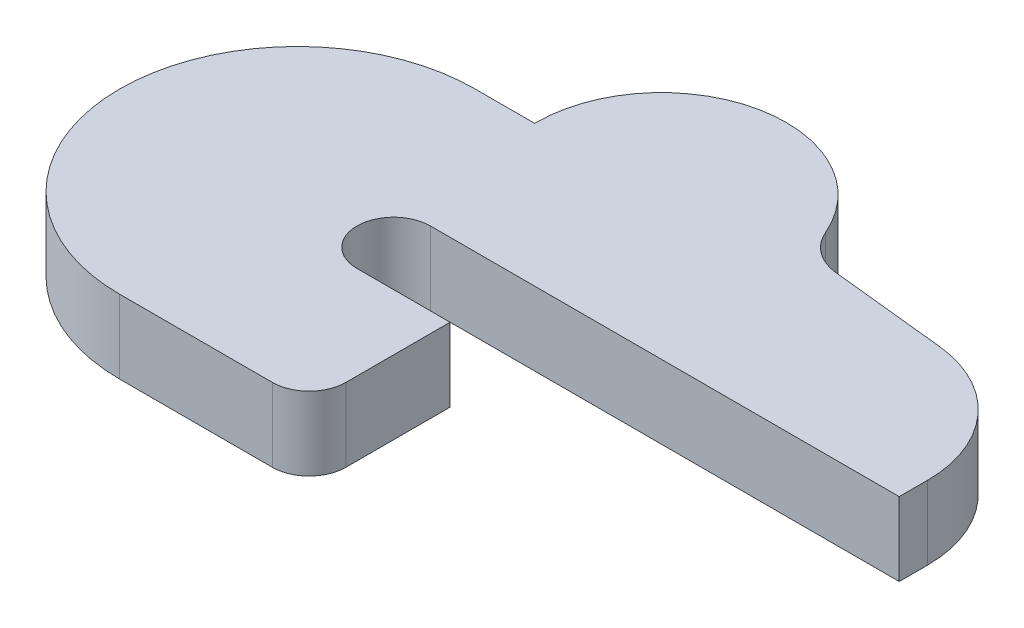
ISO-10303-21;
HEADER;
FILE_DESCRIPTION(('STEP AP214'),'2;1');
FILE_NAME('part.step','',(''),(''),'','','');
FILE_SCHEMA(('AUTOMOTIVE_DESIGN { 1 0 10303 214 1 1 1 1 }'));
ENDSEC;
DATA;
#1=APPLICATION_CONTEXT('core data for automotive mechanical design processes');
#2=APPLICATION_PROTOCOL_DEFINITION('international standard','automotive_design',2000,#1);
#3=PRODUCT_CONTEXT('',#1,'mechanical');
#4=PRODUCT('Part','Part','',(#3));
#5=PRODUCT_RELATED_PRODUCT_CATEGORY('part','',(#4));
#6=PRODUCT_DEFINITION_FORMATION('','',#4);
#7=PRODUCT_DEFINITION_CONTEXT('part definition',#1,'design');
#8=PRODUCT_DEFINITION('design','',#6,#7);
#9=PRODUCT_DEFINITION_SHAPE('','',#8);
#10=(LENGTH_UNIT() NAMED_UNIT(*) SI_UNIT(.MILLI.,.METRE.));
#11=(NAMED_UNIT(*) PLANE_ANGLE_UNIT() SI_UNIT($,.RADIAN.));
#12=(NAMED_UNIT(*) SI_UNIT($,.STERADIAN.) SOLID_ANGLE_UNIT());
#13=UNCERTAINTY_MEASURE_WITH_UNIT(LENGTH_MEASURE(1.E-05),#10,'distance_accuracy_value','');
#14=(GEOMETRIC_REPRESENTATION_CONTEXT(3) GLOBAL_UNCERTAINTY_ASSIGNED_CONTEXT((#13)) GLOBAL_UNIT_ASSIGNED_CONTEXT((#10,
#11,#12)) REPRESENTATION_CONTEXT('',''));
#15=CARTESIAN_POINT('',(0.,0.,0.));
#16=DIRECTION('',(0.,0.,1.));
#17=DIRECTION('',(1.,0.,0.));
#18=AXIS2_PLACEMENT_3D('',#15,#16,#17);
#19=CARTESIAN_POINT('',(0.,3.,4.25));
#20=DIRECTION('',(-1.,0.,0.));
#21=DIRECTION('',(0.,0.,1.));
#22=AXIS2_PLACEMENT_3D('',#19,#20,#21);
#23=PLANE('',#22);
#24=DIRECTION('',(0.,0.,-1.));
#25=VECTOR('',#24,1.);
#26=CARTESIAN_POINT('',(0.,0.,4.25));
#27=LINE('',#26,#25);
#28=CARTESIAN_POINT('',(0.,0.,4.25));
#29=VERTEX_POINT('',#28);
#30=CARTESIAN_POINT('',(0.,0.,0.));
#31=VERTEX_POINT('',#30);
#32=EDGE_CURVE('E165',#29,#31,#27,.T.);
#33=ORIENTED_EDGE('',*,*,#32,.T.);
#34=DIRECTION('',(0.,-1.,0.));
#35=VECTOR('',#34,1.);
#36=CARTESIAN_POINT('',(0.,3.,0.));
#37=LINE('',#36,#35);
#38=CARTESIAN_POINT('',(0.,3.,0.));
#39=VERTEX_POINT('',#38);
#40=EDGE_CURVE('E11',#39,#31,#37,.T.);
#41=ORIENTED_EDGE('',*,*,#40,.F.);
#42=DIRECTION('',(0.,0.,-1.));
#43=VECTOR('',#42,1.);
#44=CARTESIAN_POINT('',(0.,3.,4.25));
#45=LINE('',#44,#43);
#46=CARTESIAN_POINT('',(0.,3.,4.25));
#47=VERTEX_POINT('',#46);
#48=EDGE_CURVE('E191',#47,#39,#45,.T.);
#49=ORIENTED_EDGE('',*,*,#48,.F.);
#50=DIRECTION('',(0.,-1.,0.));
#51=VECTOR('',#50,1.);
#52=CARTESIAN_POINT('',(0.,3.,4.25));
#53=LINE('',#52,#51);
#54=EDGE_CURVE('E161',#47,#29,#53,.T.);
#55=ORIENTED_EDGE('',*,*,#54,.T.);
#56=EDGE_LOOP('',(#33,#41,#49,#55));
#57=FACE_BOUND('',#56,.T.);
#58=ADVANCED_FACE('F33',(#57),#23,.F.);
#59=CARTESIAN_POINT('',(0.,3.,0.));
#60=DIRECTION('',(0.,0.,1.));
#61=DIRECTION('',(1.,0.,0.));
#62=AXIS2_PLACEMENT_3D('',#59,#60,#61);
#63=PLANE('',#62);
#64=DIRECTION('',(-1.,0.,0.));
#65=VECTOR('',#64,1.);
#66=CARTESIAN_POINT('',(0.,0.,0.));
#67=LINE('',#66,#65);
#68=CARTESIAN_POINT('',(-3.8,0.,0.));
#69=VERTEX_POINT('',#68);
#70=EDGE_CURVE('E168',#31,#69,#67,.T.);
#71=ORIENTED_EDGE('',*,*,#70,.T.);
#72=DIRECTION('',(0.,-1.,0.));
#73=VECTOR('',#72,1.);
#74=CARTESIAN_POINT('',(-3.8,3.,0.));
#75=LINE('',#74,#73);
#76=CARTESIAN_POINT('',(-3.8,3.,0.));
#77=VERTEX_POINT('',#76);
#78=EDGE_CURVE('E41',#77,#69,#75,.T.);
#79=ORIENTED_EDGE('',*,*,#78,.F.);
#80=DIRECTION('',(-1.,0.,0.));
#81=VECTOR('',#80,1.);
#82=CARTESIAN_POINT('',(0.,3.,0.));
#83=LINE('',#82,#81);
#84=EDGE_CURVE('E110',#39,#77,#83,.T.);
#85=ORIENTED_EDGE('',*,*,#84,.F.);
#86=ORIENTED_EDGE('',*,*,#40,.T.);
#87=EDGE_LOOP('',(#71,#79,#85,#86));
#88=FACE_BOUND('',#87,.T.);
#89=ADVANCED_FACE('F279',(#88),#63,.F.);
#90=CARTESIAN_POINT('',(-3.8,3.,-1.5));
#91=DIRECTION('',(0.,-1.,0.));
#92=DIRECTION('',(0.,0.,-1.));
#93=AXIS2_PLACEMENT_3D('',#90,#91,#92);
#94=CYLINDRICAL_SURFACE('',#93,1.5);
#95=CARTESIAN_POINT('',(-3.8,0.,-1.5));
#96=DIRECTION('',(0.,-1.,0.));
#97=DIRECTION('',(0.,0.,-1.));
#98=AXIS2_PLACEMENT_3D('',#95,#96,#97);
#99=CIRCLE('',#98,1.5);
#100=CARTESIAN_POINT('',(-3.8,0.,-3.));
#101=VERTEX_POINT('',#100);
#102=EDGE_CURVE('E170',#69,#101,#99,.T.);
#103=ORIENTED_EDGE('',*,*,#102,.T.);
#104=DIRECTION('',(0.,-1.,0.));
#105=VECTOR('',#104,1.);
#106=CARTESIAN_POINT('',(-3.8,3.,-3.));
#107=LINE('',#106,#105);
#108=CARTESIAN_POINT('',(-3.8,3.,-3.));
#109=VERTEX_POINT('',#108);
#110=EDGE_CURVE('E216',#109,#101,#107,.T.);
#111=ORIENTED_EDGE('',*,*,#110,.F.);
#112=CARTESIAN_POINT('',(-3.8,3.,-1.5));
#113=DIRECTION('',(0.,-1.,0.));
#114=DIRECTION('',(0.,0.,-1.));
#115=AXIS2_PLACEMENT_3D('',#112,#113,#114);
#116=CIRCLE('',#115,1.5);
#117=EDGE_CURVE('E224',#77,#109,#116,.T.);
#118=ORIENTED_EDGE('',*,*,#117,.F.);
#119=ORIENTED_EDGE('',*,*,#78,.T.);
#120=EDGE_LOOP('',(#103,#111,#118,#119));
#121=FACE_BOUND('',#120,.T.);
#122=ADVANCED_FACE('F222',(#121),#94,.F.);
#123=CARTESIAN_POINT('',(-3.8,3.,-3.));
#124=DIRECTION('',(0.,0.,-1.));
#125=DIRECTION('',(-1.,0.,0.));
#126=AXIS2_PLACEMENT_3D('',#123,#124,#125);
#127=PLANE('',#126);
#128=DIRECTION('',(1.,0.,0.));
#129=VECTOR('',#128,1.);
#130=CARTESIAN_POINT('',(-3.8,0.,-3.));
#131=LINE('',#130,#129);
#132=CARTESIAN_POINT('',(15.32,0.,-3.));
#133=VERTEX_POINT('',#132);
#134=EDGE_CURVE('E172',#101,#133,#131,.T.);
#135=ORIENTED_EDGE('',*,*,#134,.T.);
#136=DIRECTION('',(0.,-1.,0.));
#137=VECTOR('',#136,1.);
#138=CARTESIAN_POINT('',(15.32,3.,-3.));
#139=LINE('',#138,#137);
#140=CARTESIAN_POINT('',(15.32,3.,-3.));
#141=VERTEX_POINT('',#140);
#142=EDGE_CURVE('E213',#141,#133,#139,.T.);
#143=ORIENTED_EDGE('',*,*,#142,.F.);
#144=DIRECTION('',(1.,0.,0.));
#145=VECTOR('',#144,1.);
#146=CARTESIAN_POINT('',(-3.8,3.,-3.));
#147=LINE('',#146,#145);
#148=EDGE_CURVE('E242',#109,#141,#147,.T.);
#149=ORIENTED_EDGE('',*,*,#148,.F.);
#150=ORIENTED_EDGE('',*,*,#110,.T.);
#151=EDGE_LOOP('',(#135,#143,#149,#150));
#152=FACE_BOUND('',#151,.T.);
#153=ADVANCED_FACE('F233',(#152),#127,.F.);
#154=CARTESIAN_POINT('',(15.32,3.,-3.));
#155=DIRECTION('',(-1.,0.,0.));
#156=DIRECTION('',(0.,0.,1.));
#157=AXIS2_PLACEMENT_3D('',#154,#155,#156);
#158=PLANE('',#157);
#159=DIRECTION('',(0.,0.,-1.));
#160=VECTOR('',#159,1.);
#161=CARTESIAN_POINT('',(15.32,0.,-3.));
#162=LINE('',#161,#160);
#163=CARTESIAN_POINT('',(15.32,0.,-4.15136520655236));
#164=VERTEX_POINT('',#163);
#165=EDGE_CURVE('E174',#133,#164,#162,.T.);
#166=ORIENTED_EDGE('',*,*,#165,.T.);
#167=DIRECTION('',(0.,-1.,0.));
#168=VECTOR('',#167,1.);
#169=CARTESIAN_POINT('',(15.32,3.,-4.15136520655236));
#170=LINE('',#169,#168);
#171=CARTESIAN_POINT('',(15.32,3.,-4.15136520655236));
#172=VERTEX_POINT('',#171);
#173=EDGE_CURVE('E210',#172,#164,#170,.T.);
#174=ORIENTED_EDGE('',*,*,#173,.F.);
#175=DIRECTION('',(0.,0.,-1.));
#176=VECTOR('',#175,1.);
#177=CARTESIAN_POINT('',(15.32,3.,-3.));
#178=LINE('',#177,#176);
#179=EDGE_CURVE('E239',#141,#172,#178,.T.);
#180=ORIENTED_EDGE('',*,*,#179,.F.);
#181=ORIENTED_EDGE('',*,*,#142,.T.);
#182=EDGE_LOOP('',(#166,#174,#180,#181));
#183=FACE_BOUND('',#182,.T.);
#184=ADVANCED_FACE('F237',(#183),#158,.F.);
#185=CARTESIAN_POINT('',(10.32,3.,-4.15136520655234));
#186=DIRECTION('',(0.,-1.,0.));
#187=DIRECTION('',(0.,0.,-1.));
#188=AXIS2_PLACEMENT_3D('',#185,#186,#187);
#189=CYLINDRICAL_SURFACE('',#188,5.);
#190=CARTESIAN_POINT('',(10.32,0.,-4.15136520655234));
#191=DIRECTION('',(0.,1.,0.));
#192=DIRECTION('',(0.,0.,1.));
#193=AXIS2_PLACEMENT_3D('',#190,#191,#192);
#194=CIRCLE('',#193,5.);
#195=CARTESIAN_POINT('',(10.8426423163383,0.,-9.1239746833937));
#196=VERTEX_POINT('',#195);
#197=EDGE_CURVE('E176',#164,#196,#194,.T.);
#198=ORIENTED_EDGE('',*,*,#197,.T.);
#199=DIRECTION('',(0.,-1.,0.));
#200=VECTOR('',#199,1.);
#201=CARTESIAN_POINT('',(10.8426423163383,3.,-9.1239746833937));
#202=LINE('',#201,#200);
#203=CARTESIAN_POINT('',(10.8426423163383,3.,-9.1239746833937));
#204=VERTEX_POINT('',#203);
#205=EDGE_CURVE('E207',#204,#196,#202,.T.);
#206=ORIENTED_EDGE('',*,*,#205,.F.);
#207=CARTESIAN_POINT('',(10.32,3.,-4.15136520655234));
#208=DIRECTION('',(0.,1.,0.));
#209=DIRECTION('',(0.,0.,1.));
#210=AXIS2_PLACEMENT_3D('',#207,#208,#209);
#211=CIRCLE('',#210,5.);
#212=EDGE_CURVE('E241',#172,#204,#211,.T.);
#213=ORIENTED_EDGE('',*,*,#212,.F.);
#214=ORIENTED_EDGE('',*,*,#173,.T.);
#215=EDGE_LOOP('',(#198,#206,#213,#214));
#216=FACE_BOUND('',#215,.T.);
#217=ADVANCED_FACE('F292',(#216),#189,.T.);
#218=CARTESIAN_POINT('',(6.11739670331232,3.,-9.62061800999329));
#219=DIRECTION('',(-0.104528463267653,0.,0.994521895368273));
#220=DIRECTION('',(0.994521895368273,0.,0.104528463267653));
#221=AXIS2_PLACEMENT_3D('',#218,#219,#220);
#222=PLANE('',#221);
#223=DIRECTION('',(-0.994521895368273,0.,-0.104528463267653));
#224=VECTOR('',#223,1.);
#225=CARTESIAN_POINT('',(6.11739670331232,0.,-9.62061800999329));
#226=LINE('',#225,#224);
#227=CARTESIAN_POINT('',(6.11739670331232,0.,-9.62061800999329));
#228=VERTEX_POINT('',#227);
#229=EDGE_CURVE('E178',#196,#228,#226,.T.);
#230=ORIENTED_EDGE('',*,*,#229,.T.);
#231=DIRECTION('',(0.,-1.,0.));
#232=VECTOR('',#231,1.);
#233=CARTESIAN_POINT('',(6.11739670331232,3.,-9.62061800999329));
#234=LINE('',#233,#232);
#235=CARTESIAN_POINT('',(6.11739670331232,3.,-9.62061800999329));
#236=VERTEX_POINT('',#235);
#237=EDGE_CURVE('E204',#236,#228,#234,.T.);
#238=ORIENTED_EDGE('',*,*,#237,.F.);
#239=DIRECTION('',(-0.994521895368273,0.,-0.104528463267653));
#240=VECTOR('',#239,1.);
#241=CARTESIAN_POINT('',(6.11739670331232,3.,-9.62061800999329));
#242=LINE('',#241,#240);
#243=EDGE_CURVE('E244',#204,#236,#242,.T.);
#244=ORIENTED_EDGE('',*,*,#243,.F.);
#245=ORIENTED_EDGE('',*,*,#205,.T.);
#246=EDGE_LOOP('',(#230,#238,#244,#245));
#247=FACE_BOUND('',#246,.T.);
#248=ADVANCED_FACE('F295',(#247),#222,.F.);
#249=CARTESIAN_POINT('',(6.32645362984763,3.,-11.6096618007298));
#250=DIRECTION('',(0.,-1.,0.));
#251=DIRECTION('',(0.,0.,-1.));
#252=AXIS2_PLACEMENT_3D('',#249,#250,#251);
#253=CYLINDRICAL_SURFACE('',#252,2.);
#254=CARTESIAN_POINT('',(6.32645362984763,0.,-11.6096618007298));
#255=DIRECTION('',(0.,-1.,0.));
#256=DIRECTION('',(0.,0.,1.));
#257=AXIS2_PLACEMENT_3D('',#254,#255,#256);
#258=CIRCLE('',#257,2.);
#259=CARTESIAN_POINT('',(4.48801598763703,0.,-10.8221676510988));
#260=VERTEX_POINT('',#259);
#261=EDGE_CURVE('E180',#228,#260,#258,.T.);
#262=ORIENTED_EDGE('',*,*,#261,.T.);
#263=DIRECTION('',(0.,-1.,0.));
#264=VECTOR('',#263,1.);
#265=CARTESIAN_POINT('',(4.48801598763703,3.,-10.8221676510988));
#266=LINE('',#265,#264);
#267=CARTESIAN_POINT('',(4.48801598763703,3.,-10.8221676510988));
#268=VERTEX_POINT('',#267);
#269=EDGE_CURVE('E201',#268,#260,#266,.T.);
#270=ORIENTED_EDGE('',*,*,#269,.F.);
#271=CARTESIAN_POINT('',(6.32645362984763,3.,-11.6096618007298));
#272=DIRECTION('',(0.,-1.,0.));
#273=DIRECTION('',(0.,0.,1.));
#274=AXIS2_PLACEMENT_3D('',#271,#272,#273);
#275=CIRCLE('',#274,2.);
#276=EDGE_CURVE('E250',#236,#268,#275,.T.);
#277=ORIENTED_EDGE('',*,*,#276,.F.);
#278=ORIENTED_EDGE('',*,*,#237,.T.);
#279=EDGE_LOOP('',(#262,#270,#277,#278));
#280=FACE_BOUND('',#279,.T.);
#281=ADVANCED_FACE('F299',(#280),#253,.F.);
#282=CARTESIAN_POINT('',(-0.2,3.,-8.81405756953961));
#283=DIRECTION('',(0.,-1.,0.));
#284=DIRECTION('',(0.,0.,-1.));
#285=AXIS2_PLACEMENT_3D('',#282,#283,#284);
#286=CYLINDRICAL_SURFACE('',#285,5.1);
#287=CARTESIAN_POINT('',(-0.2,0.,-8.81405756953961));
#288=DIRECTION('',(0.,1.,0.));
#289=DIRECTION('',(0.,0.,-1.));
#290=AXIS2_PLACEMENT_3D('',#287,#288,#289);
#291=CIRCLE('',#290,5.1);
#292=CARTESIAN_POINT('',(-5.3,0.,-8.81405756953961));
#293=VERTEX_POINT('',#292);
#294=EDGE_CURVE('E182',#260,#293,#291,.T.);
#295=ORIENTED_EDGE('',*,*,#294,.T.);
#296=DIRECTION('',(0.,-1.,0.));
#297=VECTOR('',#296,1.);
#298=CARTESIAN_POINT('',(-5.3,3.,-8.81405756953961));
#299=LINE('',#298,#297);
#300=CARTESIAN_POINT('',(-5.3,3.,-8.81405756953961));
#301=VERTEX_POINT('',#300);
#302=EDGE_CURVE('E198',#301,#293,#299,.T.);
#303=ORIENTED_EDGE('',*,*,#302,.F.);
#304=CARTESIAN_POINT('',(-0.2,3.,-8.81405756953961));
#305=DIRECTION('',(0.,1.,0.));
#306=DIRECTION('',(0.,0.,-1.));
#307=AXIS2_PLACEMENT_3D('',#304,#305,#306);
#308=CIRCLE('',#307,5.1);
#309=EDGE_CURVE('E252',#268,#301,#308,.T.);
#310=ORIENTED_EDGE('',*,*,#309,.F.);
#311=ORIENTED_EDGE('',*,*,#269,.T.);
#312=EDGE_LOOP('',(#295,#303,#310,#311));
#313=FACE_BOUND('',#312,.T.);
#314=ADVANCED_FACE('F303',(#313),#286,.T.);
#315=CARTESIAN_POINT('',(-5.3,3.,-8.81405756953961));
#316=DIRECTION('',(1.,0.,0.));
#317=DIRECTION('',(0.,0.,-1.));
#318=AXIS2_PLACEMENT_3D('',#315,#316,#317);
#319=PLANE('',#318);
#320=DIRECTION('',(0.,0.,1.));
#321=VECTOR('',#320,1.);
#322=CARTESIAN_POINT('',(-5.3,0.,-8.81405756953961));
#323=LINE('',#322,#321);
#324=CARTESIAN_POINT('',(-5.3,0.,-8.75000000000001));
#325=VERTEX_POINT('',#324);
#326=EDGE_CURVE('E184',#293,#325,#323,.T.);
#327=ORIENTED_EDGE('',*,*,#326,.T.);
#328=DIRECTION('',(0.,-1.,0.));
#329=VECTOR('',#328,1.);
#330=CARTESIAN_POINT('',(-5.3,3.,-8.75000000000001));
#331=LINE('',#330,#329);
#332=CARTESIAN_POINT('',(-5.3,3.,-8.75000000000001));
#333=VERTEX_POINT('',#332);
#334=EDGE_CURVE('E195',#333,#325,#331,.T.);
#335=ORIENTED_EDGE('',*,*,#334,.F.);
#336=DIRECTION('',(0.,0.,1.));
#337=VECTOR('',#336,1.);
#338=CARTESIAN_POINT('',(-5.3,3.,-8.81405756953961));
#339=LINE('',#338,#337);
#340=EDGE_CURVE('E254',#301,#333,#339,.T.);
#341=ORIENTED_EDGE('',*,*,#340,.F.);
#342=ORIENTED_EDGE('',*,*,#302,.T.);
#343=EDGE_LOOP('',(#327,#335,#341,#342));
#344=FACE_BOUND('',#343,.T.);
#345=ADVANCED_FACE('F260',(#344),#319,.F.);
#346=CARTESIAN_POINT('',(-5.3,3.,-8.75000000000001));
#347=DIRECTION('',(0.,0.,1.));
#348=DIRECTION('',(1.,0.,0.));
#349=AXIS2_PLACEMENT_3D('',#346,#347,#348);
#350=PLANE('',#349);
#351=DIRECTION('',(-1.,0.,0.));
#352=VECTOR('',#351,1.);
#353=CARTESIAN_POINT('',(-5.3,0.,-8.75000000000001));
#354=LINE('',#353,#352);
#355=CARTESIAN_POINT('',(-7.73,0.,-8.75));
#356=VERTEX_POINT('',#355);
#357=EDGE_CURVE('E186',#325,#356,#354,.T.);
#358=ORIENTED_EDGE('',*,*,#357,.T.);
#359=DIRECTION('',(0.,-1.,0.));
#360=VECTOR('',#359,1.);
#361=CARTESIAN_POINT('',(-7.73,3.,-8.75));
#362=LINE('',#361,#360);
#363=CARTESIAN_POINT('',(-7.73,3.,-8.75));
#364=VERTEX_POINT('',#363);
#365=EDGE_CURVE('E156',#364,#356,#362,.T.);
#366=ORIENTED_EDGE('',*,*,#365,.F.);
#367=DIRECTION('',(-1.,0.,0.));
#368=VECTOR('',#367,1.);
#369=CARTESIAN_POINT('',(-5.3,3.,-8.75000000000001));
#370=LINE('',#369,#368);
#371=EDGE_CURVE('E147',#333,#364,#370,.T.);
#372=ORIENTED_EDGE('',*,*,#371,.F.);
#373=ORIENTED_EDGE('',*,*,#334,.T.);
#374=EDGE_LOOP('',(#358,#366,#372,#373));
#375=FACE_BOUND('',#374,.T.);
#376=ADVANCED_FACE('F264',(#375),#350,.F.);
#377=CARTESIAN_POINT('',(-7.73,3.,-1.5));
#378=DIRECTION('',(0.,-1.,0.));
#379=DIRECTION('',(0.,0.,-1.));
#380=AXIS2_PLACEMENT_3D('',#377,#378,#379);
#381=CYLINDRICAL_SURFACE('',#380,7.25);
#382=CARTESIAN_POINT('',(-7.73,0.,-1.5));
#383=DIRECTION('',(0.,1.,0.));
#384=DIRECTION('',(0.,0.,1.));
#385=AXIS2_PLACEMENT_3D('',#382,#383,#384);
#386=CIRCLE('',#385,7.25);
#387=CARTESIAN_POINT('',(-7.73,0.,5.75));
#388=VERTEX_POINT('',#387);
#389=EDGE_CURVE('E155',#356,#388,#386,.T.);
#390=ORIENTED_EDGE('',*,*,#389,.T.);
#391=DIRECTION('',(0.,-1.,0.));
#392=VECTOR('',#391,1.);
#393=CARTESIAN_POINT('',(-7.73,3.,5.75));
#394=LINE('',#393,#392);
#395=CARTESIAN_POINT('',(-7.73,3.,5.75));
#396=VERTEX_POINT('',#395);
#397=EDGE_CURVE('E152',#396,#388,#394,.T.);
#398=ORIENTED_EDGE('',*,*,#397,.F.);
#399=CARTESIAN_POINT('',(-7.73,3.,-1.5));
#400=DIRECTION('',(0.,1.,0.));
#401=DIRECTION('',(0.,0.,1.));
#402=AXIS2_PLACEMENT_3D('',#399,#400,#401);
#403=CIRCLE('',#402,7.25);
#404=EDGE_CURVE('E141',#364,#396,#403,.T.);
#405=ORIENTED_EDGE('',*,*,#404,.F.);
#406=ORIENTED_EDGE('',*,*,#365,.T.);
#407=EDGE_LOOP('',(#390,#398,#405,#406));
#408=FACE_BOUND('',#407,.T.);
#409=ADVANCED_FACE('F153',(#408),#381,.T.);
#410=CARTESIAN_POINT('',(-7.73,3.,5.75));
#411=DIRECTION('',(0.,0.,-1.));
#412=DIRECTION('',(-1.,0.,0.));
#413=AXIS2_PLACEMENT_3D('',#410,#411,#412);
#414=PLANE('',#413);
#415=DIRECTION('',(1.,0.,0.));
#416=VECTOR('',#415,1.);
#417=CARTESIAN_POINT('',(-7.73,0.,5.75));
#418=LINE('',#417,#416);
#419=CARTESIAN_POINT('',(-1.5,0.,5.75));
#420=VERTEX_POINT('',#419);
#421=EDGE_CURVE('E96',#388,#420,#418,.T.);
#422=ORIENTED_EDGE('',*,*,#421,.T.);
#423=DIRECTION('',(0.,-1.,0.));
#424=VECTOR('',#423,1.);
#425=CARTESIAN_POINT('',(-1.5,3.,5.75));
#426=LINE('',#425,#424);
#427=CARTESIAN_POINT('',(-1.5,3.,5.75));
#428=VERTEX_POINT('',#427);
#429=EDGE_CURVE('E157',#428,#420,#426,.T.);
#430=ORIENTED_EDGE('',*,*,#429,.F.);
#431=DIRECTION('',(1.,0.,0.));
#432=VECTOR('',#431,1.);
#433=CARTESIAN_POINT('',(-7.73,3.,5.75));
#434=LINE('',#433,#432);
#435=EDGE_CURVE('E145',#396,#428,#434,.T.);
#436=ORIENTED_EDGE('',*,*,#435,.F.);
#437=ORIENTED_EDGE('',*,*,#397,.T.);
#438=EDGE_LOOP('',(#422,#430,#436,#437));
#439=FACE_BOUND('',#438,.T.);
#440=ADVANCED_FACE('F159',(#439),#414,.F.);
#441=CARTESIAN_POINT('',(-1.5,3.,4.25));
#442=DIRECTION('',(0.,-1.,0.));
#443=DIRECTION('',(0.,0.,-1.));
#444=AXIS2_PLACEMENT_3D('',#441,#442,#443);
#445=CYLINDRICAL_SURFACE('',#444,1.5);
#446=CARTESIAN_POINT('',(-1.5,0.,4.25));
#447=DIRECTION('',(0.,1.,0.));
#448=DIRECTION('',(0.,0.,1.));
#449=AXIS2_PLACEMENT_3D('',#446,#447,#448);
#450=CIRCLE('',#449,1.5);
#451=EDGE_CURVE('E102',#420,#29,#450,.T.);
#452=ORIENTED_EDGE('',*,*,#451,.T.);
#453=ORIENTED_EDGE('',*,*,#54,.F.);
#454=CARTESIAN_POINT('',(-1.5,3.,4.25));
#455=DIRECTION('',(0.,1.,0.));
#456=DIRECTION('',(0.,0.,1.));
#457=AXIS2_PLACEMENT_3D('',#454,#455,#456);
#458=CIRCLE('',#457,1.5);
#459=EDGE_CURVE('E49',#428,#47,#458,.T.);
#460=ORIENTED_EDGE('',*,*,#459,.F.);
#461=ORIENTED_EDGE('',*,*,#429,.T.);
#462=EDGE_LOOP('',(#452,#453,#460,#461));
#463=FACE_BOUND('',#462,.T.);
#464=ADVANCED_FACE('F268',(#463),#445,.T.);
#465=CARTESIAN_POINT('',(-3.8,3.,-1.5));
#466=DIRECTION('',(0.,-1.,0.));
#467=DIRECTION('',(0.,0.,-1.));
#468=AXIS2_PLACEMENT_3D('',#465,#466,#467);
#469=PLANE('',#468);
#470=ORIENTED_EDGE('',*,*,#48,.T.);
#471=ORIENTED_EDGE('',*,*,#84,.T.);
#472=ORIENTED_EDGE('',*,*,#117,.T.);
#473=ORIENTED_EDGE('',*,*,#148,.T.);
#474=ORIENTED_EDGE('',*,*,#179,.T.);
#475=ORIENTED_EDGE('',*,*,#212,.T.);
#476=ORIENTED_EDGE('',*,*,#243,.T.);
#477=ORIENTED_EDGE('',*,*,#276,.T.);
#478=ORIENTED_EDGE('',*,*,#309,.T.);
#479=ORIENTED_EDGE('',*,*,#340,.T.);
#480=ORIENTED_EDGE('',*,*,#371,.T.);
#481=ORIENTED_EDGE('',*,*,#404,.T.);
#482=ORIENTED_EDGE('',*,*,#435,.T.);
#483=ORIENTED_EDGE('',*,*,#459,.T.);
#484=EDGE_LOOP('',(#470,#471,#472,#473,#474,#475,#476,#477,#478,#479,#480,#481,#482,#483));
#485=FACE_BOUND('',#484,.T.);
#486=ADVANCED_FACE('F143',(#485),#469,.F.);
#487=CARTESIAN_POINT('',(-3.8,0.,-1.5));
#488=DIRECTION('',(0.,-1.,0.));
#489=DIRECTION('',(0.,0.,-1.));
#490=AXIS2_PLACEMENT_3D('',#487,#488,#489);
#491=PLANE('',#490);
#492=ORIENTED_EDGE('',*,*,#32,.F.);
#493=ORIENTED_EDGE('',*,*,#451,.F.);
#494=ORIENTED_EDGE('',*,*,#421,.F.);
#495=ORIENTED_EDGE('',*,*,#389,.F.);
#496=ORIENTED_EDGE('',*,*,#357,.F.);
#497=ORIENTED_EDGE('',*,*,#326,.F.);
#498=ORIENTED_EDGE('',*,*,#294,.F.);
#499=ORIENTED_EDGE('',*,*,#261,.F.);
#500=ORIENTED_EDGE('',*,*,#229,.F.);
#501=ORIENTED_EDGE('',*,*,#197,.F.);
#502=ORIENTED_EDGE('',*,*,#165,.F.);
#503=ORIENTED_EDGE('',*,*,#134,.F.);
#504=ORIENTED_EDGE('',*,*,#102,.F.);
#505=ORIENTED_EDGE('',*,*,#70,.F.);
#506=EDGE_LOOP('',(#492,#493,#494,#495,#496,#497,#498,#499,#500,#501,#502,#503,#504,#505));
#507=FACE_BOUND('',#506,.T.);
#508=ADVANCED_FACE('F228',(#507),#491,.T.);
#509=CLOSED_SHELL('',(#58,#89,#122,#153,#184,#217,#248,#281,#314,#345,#376,#409,#440,#464,#486,#508));
#510=MANIFOLD_SOLID_BREP('B2',#509);
#511=ADVANCED_BREP_SHAPE_REPRESENTATION('',(#18,#510),#14);
#512=SHAPE_DEFINITION_REPRESENTATION(#9,#511);
ENDSEC;
END-ISO-10303-21;
